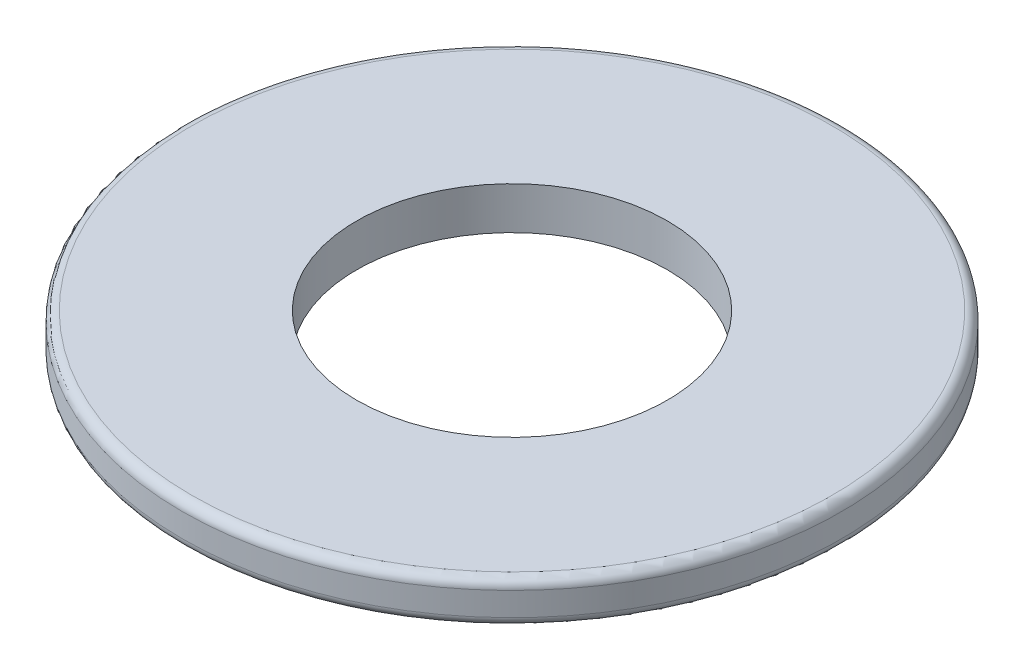
ISO-10303-21;
HEADER;
FILE_DESCRIPTION(('STEP AP214'),'2;1');
FILE_NAME('part.step','',(''),(''),'','','');
FILE_SCHEMA(('AUTOMOTIVE_DESIGN { 1 0 10303 214 1 1 1 1 }'));
ENDSEC;
DATA;
#1=APPLICATION_CONTEXT('core data for automotive mechanical design processes');
#2=APPLICATION_PROTOCOL_DEFINITION('international standard','automotive_design',2000,#1);
#3=PRODUCT_CONTEXT('',#1,'mechanical');
#4=PRODUCT('Part','Part','',(#3));
#5=PRODUCT_RELATED_PRODUCT_CATEGORY('part','',(#4));
#6=PRODUCT_DEFINITION_FORMATION('','',#4);
#7=PRODUCT_DEFINITION_CONTEXT('part definition',#1,'design');
#8=PRODUCT_DEFINITION('design','',#6,#7);
#9=PRODUCT_DEFINITION_SHAPE('','',#8);
#10=(LENGTH_UNIT() NAMED_UNIT(*) SI_UNIT(.MILLI.,.METRE.));
#11=(NAMED_UNIT(*) PLANE_ANGLE_UNIT() SI_UNIT($,.RADIAN.));
#12=(NAMED_UNIT(*) SI_UNIT($,.STERADIAN.) SOLID_ANGLE_UNIT());
#13=UNCERTAINTY_MEASURE_WITH_UNIT(LENGTH_MEASURE(1.E-05),#10,'distance_accuracy_value','');
#14=(GEOMETRIC_REPRESENTATION_CONTEXT(3) GLOBAL_UNCERTAINTY_ASSIGNED_CONTEXT((#13)) GLOBAL_UNIT_ASSIGNED_CONTEXT((#10,
#11,#12)) REPRESENTATION_CONTEXT('',''));
#15=CARTESIAN_POINT('',(0.,0.,0.));
#16=DIRECTION('',(0.,0.,1.));
#17=DIRECTION('',(1.,0.,0.));
#18=AXIS2_PLACEMENT_3D('',#15,#16,#17);
#19=CARTESIAN_POINT('',(0.,0.45,0.));
#20=DIRECTION('',(0.,1.,0.));
#21=DIRECTION('',(0.,0.,1.));
#22=AXIS2_PLACEMENT_3D('',#19,#20,#21);
#23=PLANE('',#22);
#24=CARTESIAN_POINT('',(0.,0.45,0.));
#25=DIRECTION('',(0.,1.,0.));
#26=DIRECTION('',(0.,0.,1.));
#27=AXIS2_PLACEMENT_3D('',#24,#25,#26);
#28=CIRCLE('',#27,3.4);
#29=CARTESIAN_POINT('',(0.,0.45,3.4));
#30=VERTEX_POINT('',#29);
#31=EDGE_CURVE('E10',#30,#30,#28,.T.);
#32=ORIENTED_EDGE('',*,*,#31,.T.);
#33=EDGE_LOOP('',(#32));
#34=FACE_BOUND('',#33,.T.);
#35=CARTESIAN_POINT('',(0.,0.45,0.));
#36=DIRECTION('',(0.,1.,0.));
#37=DIRECTION('',(0.,0.,1.));
#38=AXIS2_PLACEMENT_3D('',#35,#36,#37);
#39=CIRCLE('',#38,1.65);
#40=CARTESIAN_POINT('',(0.,0.45,1.65));
#41=VERTEX_POINT('',#40);
#42=EDGE_CURVE('E51',#41,#41,#39,.T.);
#43=ORIENTED_EDGE('',*,*,#42,.F.);
#44=EDGE_LOOP('',(#43));
#45=FACE_BOUND('',#44,.T.);
#46=ADVANCED_FACE('F31',(#34,#45),#23,.T.);
#47=CARTESIAN_POINT('',(0.,0.,0.));
#48=DIRECTION('',(0.,1.,0.));
#49=DIRECTION('',(0.,0.,1.));
#50=AXIS2_PLACEMENT_3D('',#47,#48,#49);
#51=PLANE('',#50);
#52=CARTESIAN_POINT('',(0.,0.,0.));
#53=DIRECTION('',(0.,1.,0.));
#54=DIRECTION('',(0.,0.,1.));
#55=AXIS2_PLACEMENT_3D('',#52,#53,#54);
#56=CIRCLE('',#55,3.4);
#57=CARTESIAN_POINT('',(0.,0.,3.4));
#58=VERTEX_POINT('',#57);
#59=EDGE_CURVE('E38',#58,#58,#56,.F.);
#60=ORIENTED_EDGE('',*,*,#59,.T.);
#61=EDGE_LOOP('',(#60));
#62=FACE_BOUND('',#61,.T.);
#63=CARTESIAN_POINT('',(0.,0.,0.));
#64=DIRECTION('',(0.,1.,0.));
#65=DIRECTION('',(0.,0.,1.));
#66=AXIS2_PLACEMENT_3D('',#63,#64,#65);
#67=CIRCLE('',#66,1.65);
#68=CARTESIAN_POINT('',(0.,0.,1.65));
#69=VERTEX_POINT('',#68);
#70=EDGE_CURVE('E52',#69,#69,#67,.T.);
#71=ORIENTED_EDGE('',*,*,#70,.T.);
#72=EDGE_LOOP('',(#71));
#73=FACE_BOUND('',#72,.T.);
#74=ADVANCED_FACE('F62',(#62,#73),#51,.F.);
#75=CARTESIAN_POINT('',(0.,0.45,0.));
#76=DIRECTION('',(0.,-1.,0.));
#77=DIRECTION('',(0.,0.,-1.));
#78=AXIS2_PLACEMENT_3D('',#75,#76,#77);
#79=CYLINDRICAL_SURFACE('',#78,3.5);
#80=CARTESIAN_POINT('',(0.,0.1,0.));
#81=DIRECTION('',(0.,1.,0.));
#82=DIRECTION('',(0.,0.,1.));
#83=AXIS2_PLACEMENT_3D('',#80,#81,#82);
#84=CIRCLE('',#83,3.5);
#85=CARTESIAN_POINT('',(0.,0.1,3.5));
#86=VERTEX_POINT('',#85);
#87=EDGE_CURVE('E42',#86,#86,#84,.T.);
#88=ORIENTED_EDGE('',*,*,#87,.T.);
#89=EDGE_LOOP('',(#88));
#90=FACE_BOUND('',#89,.T.);
#91=CARTESIAN_POINT('',(0.,0.35,0.));
#92=DIRECTION('',(0.,1.,0.));
#93=DIRECTION('',(0.,0.,1.));
#94=AXIS2_PLACEMENT_3D('',#91,#92,#93);
#95=CIRCLE('',#94,3.5);
#96=CARTESIAN_POINT('',(0.,0.35,3.5));
#97=VERTEX_POINT('',#96);
#98=EDGE_CURVE('E46',#97,#97,#95,.F.);
#99=ORIENTED_EDGE('',*,*,#98,.T.);
#100=EDGE_LOOP('',(#99));
#101=FACE_BOUND('',#100,.T.);
#102=ADVANCED_FACE('F68',(#90,#101),#79,.T.);
#103=CARTESIAN_POINT('',(0.,0.45,0.));
#104=DIRECTION('',(0.,-1.,0.));
#105=DIRECTION('',(0.,0.,-1.));
#106=AXIS2_PLACEMENT_3D('',#103,#104,#105);
#107=CYLINDRICAL_SURFACE('',#106,1.65);
#108=ORIENTED_EDGE('',*,*,#42,.T.);
#109=EDGE_LOOP('',(#108));
#110=FACE_BOUND('',#109,.T.);
#111=ORIENTED_EDGE('',*,*,#70,.F.);
#112=EDGE_LOOP('',(#111));
#113=FACE_BOUND('',#112,.T.);
#114=ADVANCED_FACE('F58',(#110,#113),#107,.F.);
#115=CARTESIAN_POINT('',(0.,0.1,0.));
#116=DIRECTION('',(0.,1.,0.));
#117=DIRECTION('',(0.,0.,1.));
#118=AXIS2_PLACEMENT_3D('',#115,#116,#117);
#119=TOROIDAL_SURFACE('',#118,3.4,0.1);
#120=ORIENTED_EDGE('',*,*,#59,.F.);
#121=EDGE_LOOP('',(#120));
#122=FACE_BOUND('',#121,.T.);
#123=ORIENTED_EDGE('',*,*,#87,.F.);
#124=EDGE_LOOP('',(#123));
#125=FACE_BOUND('',#124,.T.);
#126=ADVANCED_FACE('F74',(#122,#125),#119,.T.);
#127=CARTESIAN_POINT('',(0.,0.35,0.));
#128=DIRECTION('',(0.,1.,0.));
#129=DIRECTION('',(0.,0.,1.));
#130=AXIS2_PLACEMENT_3D('',#127,#128,#129);
#131=TOROIDAL_SURFACE('',#130,3.4,0.1);
#132=ORIENTED_EDGE('',*,*,#98,.F.);
#133=EDGE_LOOP('',(#132));
#134=FACE_BOUND('',#133,.T.);
#135=ORIENTED_EDGE('',*,*,#31,.F.);
#136=EDGE_LOOP('',(#135));
#137=FACE_BOUND('',#136,.T.);
#138=ADVANCED_FACE('F33',(#134,#137),#131,.T.);
#139=CLOSED_SHELL('',(#46,#74,#102,#114,#126,#138));
#140=MANIFOLD_SOLID_BREP('B2',#139);
#141=ADVANCED_BREP_SHAPE_REPRESENTATION('',(#18,#140),#14);
#142=SHAPE_DEFINITION_REPRESENTATION(#9,#141);
ENDSEC;
END-ISO-10303-21;
